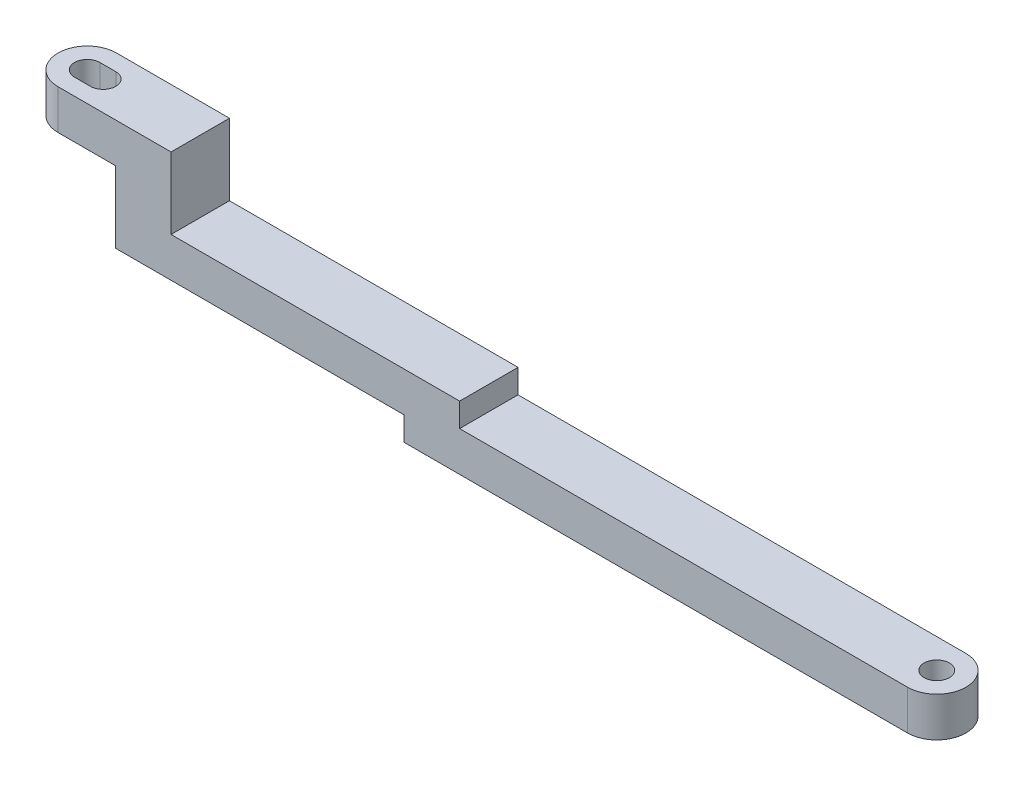
ISO-10303-21;
HEADER;
FILE_DESCRIPTION(('STEP AP214'),'2;1');
FILE_NAME('part.step','',(''),(''),'','','');
FILE_SCHEMA(('AUTOMOTIVE_DESIGN { 1 0 10303 214 1 1 1 1 }'));
ENDSEC;
DATA;
#1=APPLICATION_CONTEXT('core data for automotive mechanical design processes');
#2=APPLICATION_PROTOCOL_DEFINITION('international standard','automotive_design',2000,#1);
#3=PRODUCT_CONTEXT('',#1,'mechanical');
#4=PRODUCT('Part','Part','',(#3));
#5=PRODUCT_RELATED_PRODUCT_CATEGORY('part','',(#4));
#6=PRODUCT_DEFINITION_FORMATION('','',#4);
#7=PRODUCT_DEFINITION_CONTEXT('part definition',#1,'design');
#8=PRODUCT_DEFINITION('design','',#6,#7);
#9=PRODUCT_DEFINITION_SHAPE('','',#8);
#10=(LENGTH_UNIT() NAMED_UNIT(*) SI_UNIT(.MILLI.,.METRE.));
#11=(NAMED_UNIT(*) PLANE_ANGLE_UNIT() SI_UNIT($,.RADIAN.));
#12=(NAMED_UNIT(*) SI_UNIT($,.STERADIAN.) SOLID_ANGLE_UNIT());
#13=UNCERTAINTY_MEASURE_WITH_UNIT(LENGTH_MEASURE(1.E-05),#10,'distance_accuracy_value','');
#14=(GEOMETRIC_REPRESENTATION_CONTEXT(3) GLOBAL_UNCERTAINTY_ASSIGNED_CONTEXT((#13)) GLOBAL_UNIT_ASSIGNED_CONTEXT((#10,
#11,#12)) REPRESENTATION_CONTEXT('',''));
#15=CARTESIAN_POINT('',(0.,0.,0.));
#16=DIRECTION('',(0.,0.,1.));
#17=DIRECTION('',(1.,0.,0.));
#18=AXIS2_PLACEMENT_3D('',#15,#16,#17);
#19=CARTESIAN_POINT('',(107.,-3.00000000000203,0.));
#20=DIRECTION('',(0.,-1.,0.));
#21=DIRECTION('',(1.,0.,0.));
#22=AXIS2_PLACEMENT_3D('',#19,#20,#21);
#23=PLANE('',#22);
#24=DIRECTION('',(-1.,0.,0.));
#25=VECTOR('',#24,1.);
#26=CARTESIAN_POINT('',(136.975883288119,-3.00000000000203,3.68));
#27=LINE('',#26,#25);
#28=CARTESIAN_POINT('',(107.,-3.00000000000203,3.68));
#29=VERTEX_POINT('',#28);
#30=CARTESIAN_POINT('',(43.582681690261,-3.00000000000203,3.68));
#31=VERTEX_POINT('',#30);
#32=EDGE_CURVE('E129',#29,#31,#27,.T.);
#33=ORIENTED_EDGE('',*,*,#32,.T.);
#34=DIRECTION('',(0.,0.,1.));
#35=VECTOR('',#34,1.);
#36=CARTESIAN_POINT('',(43.582681690261,-3.00000000000203,0.));
#37=LINE('',#36,#35);
#38=CARTESIAN_POINT('',(43.582681690261,-3.00000000000203,-3.68));
#39=VERTEX_POINT('',#38);
#40=EDGE_CURVE('E243',#39,#31,#37,.T.);
#41=ORIENTED_EDGE('',*,*,#40,.F.);
#42=DIRECTION('',(1.,0.,0.));
#43=VECTOR('',#42,1.);
#44=CARTESIAN_POINT('',(136.975883288119,-3.00000000000203,-3.68));
#45=LINE('',#44,#43);
#46=CARTESIAN_POINT('',(107.,-3.00000000000203,-3.68));
#47=VERTEX_POINT('',#46);
#48=EDGE_CURVE('E100',#39,#47,#45,.T.);
#49=ORIENTED_EDGE('',*,*,#48,.T.);
#50=CARTESIAN_POINT('',(107.,-3.00000000000203,0.));
#51=DIRECTION('',(0.,-1.,0.));
#52=DIRECTION('',(1.,0.,0.));
#53=AXIS2_PLACEMENT_3D('',#50,#51,#52);
#54=CIRCLE('',#53,3.68);
#55=EDGE_CURVE('E264',#47,#29,#54,.T.);
#56=ORIENTED_EDGE('',*,*,#55,.T.);
#57=EDGE_LOOP('',(#33,#41,#49,#56));
#58=FACE_BOUND('',#57,.T.);
#59=CARTESIAN_POINT('',(107.,-3.00000000000203,0.));
#60=DIRECTION('',(0.,-1.,0.));
#61=DIRECTION('',(1.,0.,0.));
#62=AXIS2_PLACEMENT_3D('',#59,#60,#61);
#63=CIRCLE('',#62,1.60000000000001);
#64=CARTESIAN_POINT('',(108.6,-3.00000000000203,0.));
#65=VERTEX_POINT('',#64);
#66=EDGE_CURVE('E139',#65,#65,#63,.T.);
#67=ORIENTED_EDGE('',*,*,#66,.F.);
#68=EDGE_LOOP('',(#67));
#69=FACE_BOUND('',#68,.T.);
#70=ADVANCED_FACE('F81',(#58,#69),#23,.T.);
#71=CARTESIAN_POINT('',(107.,1.99999999999797,0.));
#72=DIRECTION('',(0.,-1.,0.));
#73=DIRECTION('',(1.,0.,0.));
#74=AXIS2_PLACEMENT_3D('',#71,#72,#73);
#75=PLANE('',#74);
#76=DIRECTION('',(0.,0.,1.));
#77=VECTOR('',#76,1.);
#78=CARTESIAN_POINT('',(50.582681690261,1.99999999999797,1.20267248289405));
#79=LINE('',#78,#77);
#80=CARTESIAN_POINT('',(50.582681690261,1.99999999999797,-3.68));
#81=VERTEX_POINT('',#80);
#82=CARTESIAN_POINT('',(50.582681690261,1.99999999999797,3.68));
#83=VERTEX_POINT('',#82);
#84=EDGE_CURVE('E124',#81,#83,#79,.T.);
#85=ORIENTED_EDGE('',*,*,#84,.T.);
#86=DIRECTION('',(-1.,0.,0.));
#87=VECTOR('',#86,1.);
#88=CARTESIAN_POINT('',(136.975883288119,1.99999999999797,3.68));
#89=LINE('',#88,#87);
#90=CARTESIAN_POINT('',(107.,1.99999999999797,3.68));
#91=VERTEX_POINT('',#90);
#92=EDGE_CURVE('E140',#91,#83,#89,.T.);
#93=ORIENTED_EDGE('',*,*,#92,.F.);
#94=CARTESIAN_POINT('',(107.,1.99999999999797,0.));
#95=DIRECTION('',(0.,-1.,0.));
#96=DIRECTION('',(1.,0.,0.));
#97=AXIS2_PLACEMENT_3D('',#94,#95,#96);
#98=CIRCLE('',#97,3.68);
#99=CARTESIAN_POINT('',(107.,1.99999999999797,-3.68));
#100=VERTEX_POINT('',#99);
#101=EDGE_CURVE('E123',#100,#91,#98,.T.);
#102=ORIENTED_EDGE('',*,*,#101,.F.);
#103=DIRECTION('',(1.,0.,0.));
#104=VECTOR('',#103,1.);
#105=CARTESIAN_POINT('',(136.975883288119,1.99999999999797,-3.68));
#106=LINE('',#105,#104);
#107=EDGE_CURVE('E114',#81,#100,#106,.T.);
#108=ORIENTED_EDGE('',*,*,#107,.F.);
#109=EDGE_LOOP('',(#85,#93,#102,#108));
#110=FACE_BOUND('',#109,.T.);
#111=CARTESIAN_POINT('',(107.,1.99999999999797,0.));
#112=DIRECTION('',(0.,-1.,0.));
#113=DIRECTION('',(1.,0.,0.));
#114=AXIS2_PLACEMENT_3D('',#111,#112,#113);
#115=CIRCLE('',#114,1.60000000000001);
#116=CARTESIAN_POINT('',(108.6,1.99999999999797,0.));
#117=VERTEX_POINT('',#116);
#118=EDGE_CURVE('E250',#117,#117,#115,.T.);
#119=ORIENTED_EDGE('',*,*,#118,.T.);
#120=EDGE_LOOP('',(#119));
#121=FACE_BOUND('',#120,.T.);
#122=ADVANCED_FACE('F119',(#110,#121),#75,.F.);
#123=CARTESIAN_POINT('',(136.975883288119,-3.00000000000203,-3.68));
#124=DIRECTION('',(0.,0.,1.));
#125=DIRECTION('',(1.,0.,0.));
#126=AXIS2_PLACEMENT_3D('',#123,#124,#125);
#127=PLANE('',#126);
#128=DIRECTION('',(0.,-1.,0.));
#129=VECTOR('',#128,1.);
#130=CARTESIAN_POINT('',(50.582681690261,13.9999999999988,-3.68));
#131=LINE('',#130,#129);
#132=CARTESIAN_POINT('',(50.582681690261,5.,-3.68));
#133=VERTEX_POINT('',#132);
#134=EDGE_CURVE('E132',#133,#81,#131,.T.);
#135=ORIENTED_EDGE('',*,*,#134,.T.);
#136=ORIENTED_EDGE('',*,*,#107,.T.);
#137=DIRECTION('',(0.,1.,0.));
#138=VECTOR('',#137,1.);
#139=CARTESIAN_POINT('',(107.,-3.00000000000203,-3.68));
#140=LINE('',#139,#138);
#141=EDGE_CURVE('E12',#47,#100,#140,.T.);
#142=ORIENTED_EDGE('',*,*,#141,.F.);
#143=ORIENTED_EDGE('',*,*,#48,.F.);
#144=DIRECTION('',(0.,1.,0.));
#145=VECTOR('',#144,1.);
#146=CARTESIAN_POINT('',(43.582681690261,-13.1572437206184,-3.68));
#147=LINE('',#146,#145);
#148=CARTESIAN_POINT('',(43.582681690261,0.,-3.68));
#149=VERTEX_POINT('',#148);
#150=EDGE_CURVE('E247',#39,#149,#147,.T.);
#151=ORIENTED_EDGE('',*,*,#150,.T.);
#152=DIRECTION('',(1.,0.,0.));
#153=VECTOR('',#152,1.);
#154=CARTESIAN_POINT('',(0.,0.,-3.68));
#155=LINE('',#154,#153);
#156=CARTESIAN_POINT('',(7.2341425037902,0.,-3.68));
#157=VERTEX_POINT('',#156);
#158=EDGE_CURVE('E152',#157,#149,#155,.T.);
#159=ORIENTED_EDGE('',*,*,#158,.F.);
#160=DIRECTION('',(0.,-1.,0.));
#161=VECTOR('',#160,1.);
#162=CARTESIAN_POINT('',(7.2341425037902,24.1572437206151,-3.68));
#163=LINE('',#162,#161);
#164=CARTESIAN_POINT('',(7.2341425037902,8.99999999999878,-3.68));
#165=VERTEX_POINT('',#164);
#166=EDGE_CURVE('E166',#165,#157,#163,.T.);
#167=ORIENTED_EDGE('',*,*,#166,.F.);
#168=DIRECTION('',(-1.,0.,0.));
#169=VECTOR('',#168,1.);
#170=CARTESIAN_POINT('',(-8.85333473199523E-11,8.99999999999878,-3.68));
#171=LINE('',#170,#169);
#172=CARTESIAN_POINT('',(0.,8.99999999999878,-3.68));
#173=VERTEX_POINT('',#172);
#174=EDGE_CURVE('E225',#165,#173,#171,.T.);
#175=ORIENTED_EDGE('',*,*,#174,.T.);
#176=DIRECTION('',(0.,1.,0.));
#177=VECTOR('',#176,1.);
#178=CARTESIAN_POINT('',(0.,8.99999999999878,-3.68));
#179=LINE('',#178,#177);
#180=CARTESIAN_POINT('',(0.,13.9999999999988,-3.68));
#181=VERTEX_POINT('',#180);
#182=EDGE_CURVE('E223',#173,#181,#179,.T.);
#183=ORIENTED_EDGE('',*,*,#182,.T.);
#184=DIRECTION('',(-1.,0.,0.));
#185=VECTOR('',#184,1.);
#186=CARTESIAN_POINT('',(-8.85333473199523E-11,13.9999999999988,-3.68));
#187=LINE('',#186,#185);
#188=CARTESIAN_POINT('',(14.2341425037902,13.9999999999988,-3.68));
#189=VERTEX_POINT('',#188);
#190=EDGE_CURVE('E218',#189,#181,#187,.T.);
#191=ORIENTED_EDGE('',*,*,#190,.F.);
#192=DIRECTION('',(0.,-1.,0.));
#193=VECTOR('',#192,1.);
#194=CARTESIAN_POINT('',(14.2341425037902,24.1572437206151,-3.68));
#195=LINE('',#194,#193);
#196=CARTESIAN_POINT('',(14.2341425037902,5.,-3.68));
#197=VERTEX_POINT('',#196);
#198=EDGE_CURVE('E164',#189,#197,#195,.T.);
#199=ORIENTED_EDGE('',*,*,#198,.T.);
#200=DIRECTION('',(-1.,0.,0.));
#201=VECTOR('',#200,1.);
#202=CARTESIAN_POINT('',(0.,5.,-3.68));
#203=LINE('',#202,#201);
#204=EDGE_CURVE('E144',#133,#197,#203,.T.);
#205=ORIENTED_EDGE('',*,*,#204,.F.);
#206=EDGE_LOOP('',(#135,#136,#142,#143,#151,#159,#167,#175,#183,#191,#199,#205));
#207=FACE_BOUND('',#206,.T.);
#208=ADVANCED_FACE('F142',(#207),#127,.F.);
#209=CARTESIAN_POINT('',(107.,-3.00000000000203,0.));
#210=DIRECTION('',(0.,1.,0.));
#211=DIRECTION('',(0.,0.,1.));
#212=AXIS2_PLACEMENT_3D('',#209,#210,#211);
#213=CYLINDRICAL_SURFACE('',#212,3.68);
#214=ORIENTED_EDGE('',*,*,#101,.T.);
#215=DIRECTION('',(0.,1.,0.));
#216=VECTOR('',#215,1.);
#217=CARTESIAN_POINT('',(107.,-3.00000000000203,3.68));
#218=LINE('',#217,#216);
#219=EDGE_CURVE('E88',#29,#91,#218,.T.);
#220=ORIENTED_EDGE('',*,*,#219,.F.);
#221=ORIENTED_EDGE('',*,*,#55,.F.);
#222=ORIENTED_EDGE('',*,*,#141,.T.);
#223=EDGE_LOOP('',(#214,#220,#221,#222));
#224=FACE_BOUND('',#223,.T.);
#225=ADVANCED_FACE('F266',(#224),#213,.T.);
#226=CARTESIAN_POINT('',(136.975883288119,-3.00000000000203,3.68));
#227=DIRECTION('',(0.,0.,-1.));
#228=DIRECTION('',(-1.,0.,0.));
#229=AXIS2_PLACEMENT_3D('',#226,#227,#228);
#230=PLANE('',#229);
#231=ORIENTED_EDGE('',*,*,#92,.T.);
#232=DIRECTION('',(0.,-1.,0.));
#233=VECTOR('',#232,1.);
#234=CARTESIAN_POINT('',(50.582681690261,13.9999999999988,3.68));
#235=LINE('',#234,#233);
#236=CARTESIAN_POINT('',(50.582681690261,5.,3.68));
#237=VERTEX_POINT('',#236);
#238=EDGE_CURVE('E137',#237,#83,#235,.T.);
#239=ORIENTED_EDGE('',*,*,#238,.F.);
#240=DIRECTION('',(1.,0.,0.));
#241=VECTOR('',#240,1.);
#242=CARTESIAN_POINT('',(0.,5.,3.68));
#243=LINE('',#242,#241);
#244=CARTESIAN_POINT('',(14.2341425037902,5.,3.68));
#245=VERTEX_POINT('',#244);
#246=EDGE_CURVE('E143',#245,#237,#243,.T.);
#247=ORIENTED_EDGE('',*,*,#246,.F.);
#248=DIRECTION('',(0.,-1.,0.));
#249=VECTOR('',#248,1.);
#250=CARTESIAN_POINT('',(14.2341425037902,24.1572437206151,3.68));
#251=LINE('',#250,#249);
#252=CARTESIAN_POINT('',(14.2341425037902,13.9999999999988,3.68));
#253=VERTEX_POINT('',#252);
#254=EDGE_CURVE('E170',#253,#245,#251,.T.);
#255=ORIENTED_EDGE('',*,*,#254,.F.);
#256=DIRECTION('',(1.,0.,0.));
#257=VECTOR('',#256,1.);
#258=CARTESIAN_POINT('',(-8.85333473199523E-11,13.9999999999988,3.68));
#259=LINE('',#258,#257);
#260=CARTESIAN_POINT('',(0.,13.9999999999988,3.68));
#261=VERTEX_POINT('',#260);
#262=EDGE_CURVE('E214',#261,#253,#259,.T.);
#263=ORIENTED_EDGE('',*,*,#262,.F.);
#264=DIRECTION('',(0.,1.,0.));
#265=VECTOR('',#264,1.);
#266=CARTESIAN_POINT('',(0.,8.99999999999879,3.68));
#267=LINE('',#266,#265);
#268=CARTESIAN_POINT('',(0.,8.99999999999879,3.68));
#269=VERTEX_POINT('',#268);
#270=EDGE_CURVE('E232',#269,#261,#267,.T.);
#271=ORIENTED_EDGE('',*,*,#270,.F.);
#272=DIRECTION('',(1.,0.,0.));
#273=VECTOR('',#272,1.);
#274=CARTESIAN_POINT('',(-8.85333473199523E-11,8.99999999999879,3.68));
#275=LINE('',#274,#273);
#276=CARTESIAN_POINT('',(7.2341425037902,8.99999999999879,3.68));
#277=VERTEX_POINT('',#276);
#278=EDGE_CURVE('E212',#269,#277,#275,.T.);
#279=ORIENTED_EDGE('',*,*,#278,.T.);
#280=DIRECTION('',(0.,-1.,0.));
#281=VECTOR('',#280,1.);
#282=CARTESIAN_POINT('',(7.2341425037902,24.1572437206151,3.68));
#283=LINE('',#282,#281);
#284=CARTESIAN_POINT('',(7.2341425037902,0.,3.68));
#285=VERTEX_POINT('',#284);
#286=EDGE_CURVE('E157',#277,#285,#283,.T.);
#287=ORIENTED_EDGE('',*,*,#286,.T.);
#288=DIRECTION('',(-1.,0.,0.));
#289=VECTOR('',#288,1.);
#290=CARTESIAN_POINT('',(0.,0.,3.68));
#291=LINE('',#290,#289);
#292=CARTESIAN_POINT('',(43.582681690261,0.,3.68));
#293=VERTEX_POINT('',#292);
#294=EDGE_CURVE('E158',#293,#285,#291,.T.);
#295=ORIENTED_EDGE('',*,*,#294,.F.);
#296=DIRECTION('',(0.,1.,0.));
#297=VECTOR('',#296,1.);
#298=CARTESIAN_POINT('',(43.582681690261,-13.1572437206184,3.68));
#299=LINE('',#298,#297);
#300=EDGE_CURVE('E252',#31,#293,#299,.T.);
#301=ORIENTED_EDGE('',*,*,#300,.F.);
#302=ORIENTED_EDGE('',*,*,#32,.F.);
#303=ORIENTED_EDGE('',*,*,#219,.T.);
#304=EDGE_LOOP('',(#231,#239,#247,#255,#263,#271,#279,#287,#295,#301,#302,#303));
#305=FACE_BOUND('',#304,.T.);
#306=ADVANCED_FACE('F83',(#305),#230,.F.);
#307=CARTESIAN_POINT('',(107.,-3.00000000000203,0.));
#308=DIRECTION('',(0.,1.,0.));
#309=DIRECTION('',(0.,0.,1.));
#310=AXIS2_PLACEMENT_3D('',#307,#308,#309);
#311=CYLINDRICAL_SURFACE('',#310,1.60000000000001);
#312=ORIENTED_EDGE('',*,*,#66,.T.);
#313=EDGE_LOOP('',(#312));
#314=FACE_BOUND('',#313,.T.);
#315=ORIENTED_EDGE('',*,*,#118,.F.);
#316=EDGE_LOOP('',(#315));
#317=FACE_BOUND('',#316,.T.);
#318=ADVANCED_FACE('F368',(#314,#317),#311,.F.);
#319=CARTESIAN_POINT('',(43.582681690261,-13.1572437206184,0.));
#320=DIRECTION('',(-1.,0.,0.));
#321=DIRECTION('',(0.,0.,1.));
#322=AXIS2_PLACEMENT_3D('',#319,#320,#321);
#323=PLANE('',#322);
#324=ORIENTED_EDGE('',*,*,#150,.F.);
#325=ORIENTED_EDGE('',*,*,#40,.T.);
#326=ORIENTED_EDGE('',*,*,#300,.T.);
#327=DIRECTION('',(0.,0.,1.));
#328=VECTOR('',#327,1.);
#329=CARTESIAN_POINT('',(43.582681690261,0.,0.));
#330=LINE('',#329,#328);
#331=EDGE_CURVE('E242',#149,#293,#330,.T.);
#332=ORIENTED_EDGE('',*,*,#331,.F.);
#333=EDGE_LOOP('',(#324,#325,#326,#332));
#334=FACE_BOUND('',#333,.T.);
#335=ADVANCED_FACE('F366',(#334),#323,.T.);
#336=CARTESIAN_POINT('',(50.582681690261,13.9999999999988,0.));
#337=DIRECTION('',(1.,0.,0.));
#338=DIRECTION('',(0.,0.,-1.));
#339=AXIS2_PLACEMENT_3D('',#336,#337,#338);
#340=PLANE('',#339);
#341=ORIENTED_EDGE('',*,*,#84,.F.);
#342=ORIENTED_EDGE('',*,*,#134,.F.);
#343=DIRECTION('',(0.,0.,-1.));
#344=VECTOR('',#343,1.);
#345=CARTESIAN_POINT('',(50.582681690261,5.,0.));
#346=LINE('',#345,#344);
#347=EDGE_CURVE('E241',#237,#133,#346,.T.);
#348=ORIENTED_EDGE('',*,*,#347,.F.);
#349=ORIENTED_EDGE('',*,*,#238,.T.);
#350=EDGE_LOOP('',(#341,#342,#348,#349));
#351=FACE_BOUND('',#350,.T.);
#352=ADVANCED_FACE('F127',(#351),#340,.T.);
#353=CARTESIAN_POINT('',(0.,0.,0.));
#354=DIRECTION('',(0.,-1.,0.));
#355=DIRECTION('',(0.,0.,-1.));
#356=AXIS2_PLACEMENT_3D('',#353,#354,#355);
#357=PLANE('',#356);
#358=ORIENTED_EDGE('',*,*,#158,.T.);
#359=ORIENTED_EDGE('',*,*,#331,.T.);
#360=ORIENTED_EDGE('',*,*,#294,.T.);
#361=DIRECTION('',(0.,0.,-1.));
#362=VECTOR('',#361,1.);
#363=CARTESIAN_POINT('',(7.2341425037902,0.,0.));
#364=LINE('',#363,#362);
#365=EDGE_CURVE('E160',#285,#157,#364,.T.);
#366=ORIENTED_EDGE('',*,*,#365,.T.);
#367=EDGE_LOOP('',(#358,#359,#360,#366));
#368=FACE_BOUND('',#367,.T.);
#369=ADVANCED_FACE('F365',(#368),#357,.T.);
#370=CARTESIAN_POINT('',(0.,5.,0.));
#371=DIRECTION('',(0.,1.,0.));
#372=DIRECTION('',(0.,0.,1.));
#373=AXIS2_PLACEMENT_3D('',#370,#371,#372);
#374=PLANE('',#373);
#375=ORIENTED_EDGE('',*,*,#246,.T.);
#376=ORIENTED_EDGE('',*,*,#347,.T.);
#377=ORIENTED_EDGE('',*,*,#204,.T.);
#378=DIRECTION('',(0.,0.,-1.));
#379=VECTOR('',#378,1.);
#380=CARTESIAN_POINT('',(14.2341425037902,5.,0.));
#381=LINE('',#380,#379);
#382=EDGE_CURVE('E238',#245,#197,#381,.T.);
#383=ORIENTED_EDGE('',*,*,#382,.F.);
#384=EDGE_LOOP('',(#375,#376,#377,#383));
#385=FACE_BOUND('',#384,.T.);
#386=ADVANCED_FACE('F336',(#385),#374,.T.);
#387=CARTESIAN_POINT('',(0.,8.99999999999878,0.));
#388=DIRECTION('',(0.,1.,0.));
#389=DIRECTION('',(0.,0.,1.));
#390=AXIS2_PLACEMENT_3D('',#387,#388,#389);
#391=PLANE('',#390);
#392=DIRECTION('',(0.,0.,1.));
#393=VECTOR('',#392,1.);
#394=CARTESIAN_POINT('',(7.2341425037902,8.99999999999879,-1.96917283696128E-11));
#395=LINE('',#394,#393);
#396=EDGE_CURVE('E211',#165,#277,#395,.T.);
#397=ORIENTED_EDGE('',*,*,#396,.T.);
#398=ORIENTED_EDGE('',*,*,#278,.F.);
#399=CARTESIAN_POINT('',(0.,8.99999999999878,0.));
#400=DIRECTION('',(0.,1.,0.));
#401=DIRECTION('',(0.,0.,1.));
#402=AXIS2_PLACEMENT_3D('',#399,#400,#401);
#403=CIRCLE('',#402,3.68);
#404=EDGE_CURVE('E220',#173,#269,#403,.T.);
#405=ORIENTED_EDGE('',*,*,#404,.F.);
#406=ORIENTED_EDGE('',*,*,#174,.F.);
#407=EDGE_LOOP('',(#397,#398,#405,#406));
#408=FACE_BOUND('',#407,.T.);
#409=DIRECTION('',(-1.,0.,0.));
#410=VECTOR('',#409,1.);
#411=CARTESIAN_POINT('',(-8.85333473199523E-11,8.99999999999879,1.6));
#412=LINE('',#411,#410);
#413=CARTESIAN_POINT('',(2.,8.99999999999879,1.6));
#414=VERTEX_POINT('',#413);
#415=CARTESIAN_POINT('',(0.,8.99999999999879,1.6));
#416=VERTEX_POINT('',#415);
#417=EDGE_CURVE('E176',#414,#416,#412,.T.);
#418=ORIENTED_EDGE('',*,*,#417,.F.);
#419=CARTESIAN_POINT('',(2.,8.99999999999878,0.));
#420=DIRECTION('',(0.,1.,0.));
#421=DIRECTION('',(0.,0.,1.));
#422=AXIS2_PLACEMENT_3D('',#419,#420,#421);
#423=CIRCLE('',#422,1.6);
#424=CARTESIAN_POINT('',(2.,8.99999999999878,-1.6));
#425=VERTEX_POINT('',#424);
#426=EDGE_CURVE('E187',#414,#425,#423,.T.);
#427=ORIENTED_EDGE('',*,*,#426,.T.);
#428=DIRECTION('',(1.,0.,0.));
#429=VECTOR('',#428,1.);
#430=CARTESIAN_POINT('',(-8.85333473199523E-11,8.99999999999878,-1.6));
#431=LINE('',#430,#429);
#432=CARTESIAN_POINT('',(0.,8.99999999999878,-1.6));
#433=VERTEX_POINT('',#432);
#434=EDGE_CURVE('E182',#433,#425,#431,.T.);
#435=ORIENTED_EDGE('',*,*,#434,.F.);
#436=CARTESIAN_POINT('',(0.,8.99999999999878,0.));
#437=DIRECTION('',(0.,1.,0.));
#438=DIRECTION('',(0.,0.,1.));
#439=AXIS2_PLACEMENT_3D('',#436,#437,#438);
#440=CIRCLE('',#439,1.6);
#441=EDGE_CURVE('E177',#433,#416,#440,.T.);
#442=ORIENTED_EDGE('',*,*,#441,.T.);
#443=EDGE_LOOP('',(#418,#427,#435,#442));
#444=FACE_BOUND('',#443,.T.);
#445=ADVANCED_FACE('F351',(#408,#444),#391,.F.);
#446=CARTESIAN_POINT('',(0.,13.9999999999988,0.));
#447=DIRECTION('',(0.,1.,0.));
#448=DIRECTION('',(0.,0.,1.));
#449=AXIS2_PLACEMENT_3D('',#446,#447,#448);
#450=PLANE('',#449);
#451=ORIENTED_EDGE('',*,*,#262,.T.);
#452=DIRECTION('',(0.,0.,-1.));
#453=VECTOR('',#452,1.);
#454=CARTESIAN_POINT('',(14.2341425037902,13.9999999999988,0.));
#455=LINE('',#454,#453);
#456=EDGE_CURVE('E154',#253,#189,#455,.T.);
#457=ORIENTED_EDGE('',*,*,#456,.T.);
#458=ORIENTED_EDGE('',*,*,#190,.T.);
#459=CARTESIAN_POINT('',(0.,13.9999999999988,0.));
#460=DIRECTION('',(0.,1.,0.));
#461=DIRECTION('',(0.,0.,1.));
#462=AXIS2_PLACEMENT_3D('',#459,#460,#461);
#463=CIRCLE('',#462,3.68);
#464=EDGE_CURVE('E226',#181,#261,#463,.T.);
#465=ORIENTED_EDGE('',*,*,#464,.T.);
#466=EDGE_LOOP('',(#451,#457,#458,#465));
#467=FACE_BOUND('',#466,.T.);
#468=CARTESIAN_POINT('',(2.,13.9999999999988,0.));
#469=DIRECTION('',(0.,1.,0.));
#470=DIRECTION('',(0.,0.,1.));
#471=AXIS2_PLACEMENT_3D('',#468,#469,#470);
#472=CIRCLE('',#471,1.6);
#473=CARTESIAN_POINT('',(2.,13.9999999999988,1.6));
#474=VERTEX_POINT('',#473);
#475=CARTESIAN_POINT('',(2.,13.9999999999988,-1.6));
#476=VERTEX_POINT('',#475);
#477=EDGE_CURVE('E179',#474,#476,#472,.T.);
#478=ORIENTED_EDGE('',*,*,#477,.F.);
#479=DIRECTION('',(-1.,0.,0.));
#480=VECTOR('',#479,1.);
#481=CARTESIAN_POINT('',(-8.85333473199523E-11,13.9999999999988,1.6));
#482=LINE('',#481,#480);
#483=CARTESIAN_POINT('',(0.,13.9999999999988,1.6));
#484=VERTEX_POINT('',#483);
#485=EDGE_CURVE('E174',#474,#484,#482,.T.);
#486=ORIENTED_EDGE('',*,*,#485,.T.);
#487=CARTESIAN_POINT('',(0.,13.9999999999988,0.));
#488=DIRECTION('',(0.,1.,0.));
#489=DIRECTION('',(0.,0.,1.));
#490=AXIS2_PLACEMENT_3D('',#487,#488,#489);
#491=CIRCLE('',#490,1.6);
#492=CARTESIAN_POINT('',(0.,13.9999999999988,-1.6));
#493=VERTEX_POINT('',#492);
#494=EDGE_CURVE('E191',#493,#484,#491,.T.);
#495=ORIENTED_EDGE('',*,*,#494,.F.);
#496=DIRECTION('',(1.,0.,0.));
#497=VECTOR('',#496,1.);
#498=CARTESIAN_POINT('',(-8.85333473199523E-11,13.9999999999988,-1.6));
#499=LINE('',#498,#497);
#500=EDGE_CURVE('E192',#493,#476,#499,.T.);
#501=ORIENTED_EDGE('',*,*,#500,.T.);
#502=EDGE_LOOP('',(#478,#486,#495,#501));
#503=FACE_BOUND('',#502,.T.);
#504=ADVANCED_FACE('F342',(#467,#503),#450,.T.);
#505=CARTESIAN_POINT('',(0.,8.99999999999878,0.));
#506=DIRECTION('',(0.,1.,0.));
#507=DIRECTION('',(0.,0.,1.));
#508=AXIS2_PLACEMENT_3D('',#505,#506,#507);
#509=CYLINDRICAL_SURFACE('',#508,3.68);
#510=ORIENTED_EDGE('',*,*,#464,.F.);
#511=ORIENTED_EDGE('',*,*,#182,.F.);
#512=ORIENTED_EDGE('',*,*,#404,.T.);
#513=ORIENTED_EDGE('',*,*,#270,.T.);
#514=EDGE_LOOP('',(#510,#511,#512,#513));
#515=FACE_BOUND('',#514,.T.);
#516=ADVANCED_FACE('F346',(#515),#509,.T.);
#517=CARTESIAN_POINT('',(-8.85333473199523E-11,8.99999999999879,1.6));
#518=DIRECTION('',(0.,0.,-1.));
#519=DIRECTION('',(-1.,0.,0.));
#520=AXIS2_PLACEMENT_3D('',#517,#518,#519);
#521=PLANE('',#520);
#522=ORIENTED_EDGE('',*,*,#485,.F.);
#523=DIRECTION('',(0.,1.,0.));
#524=VECTOR('',#523,1.);
#525=CARTESIAN_POINT('',(2.,8.99999999999879,1.6));
#526=LINE('',#525,#524);
#527=EDGE_CURVE('E186',#414,#474,#526,.T.);
#528=ORIENTED_EDGE('',*,*,#527,.F.);
#529=ORIENTED_EDGE('',*,*,#417,.T.);
#530=DIRECTION('',(0.,1.,0.));
#531=VECTOR('',#530,1.);
#532=CARTESIAN_POINT('',(0.,8.99999999999879,1.6));
#533=LINE('',#532,#531);
#534=EDGE_CURVE('E206',#416,#484,#533,.T.);
#535=ORIENTED_EDGE('',*,*,#534,.T.);
#536=EDGE_LOOP('',(#522,#528,#529,#535));
#537=FACE_BOUND('',#536,.T.);
#538=ADVANCED_FACE('F477',(#537),#521,.T.);
#539=CARTESIAN_POINT('',(0.,8.99999999999878,0.));
#540=DIRECTION('',(0.,1.,0.));
#541=DIRECTION('',(0.,0.,1.));
#542=AXIS2_PLACEMENT_3D('',#539,#540,#541);
#543=CYLINDRICAL_SURFACE('',#542,1.6);
#544=ORIENTED_EDGE('',*,*,#494,.T.);
#545=ORIENTED_EDGE('',*,*,#534,.F.);
#546=ORIENTED_EDGE('',*,*,#441,.F.);
#547=DIRECTION('',(0.,1.,0.));
#548=VECTOR('',#547,1.);
#549=CARTESIAN_POINT('',(0.,8.99999999999878,-1.6));
#550=LINE('',#549,#548);
#551=EDGE_CURVE('E203',#433,#493,#550,.T.);
#552=ORIENTED_EDGE('',*,*,#551,.T.);
#553=EDGE_LOOP('',(#544,#545,#546,#552));
#554=FACE_BOUND('',#553,.T.);
#555=ADVANCED_FACE('F481',(#554),#543,.F.);
#556=CARTESIAN_POINT('',(-8.85333473199523E-11,8.99999999999878,-1.6));
#557=DIRECTION('',(0.,0.,1.));
#558=DIRECTION('',(1.,0.,0.));
#559=AXIS2_PLACEMENT_3D('',#556,#557,#558);
#560=PLANE('',#559);
#561=ORIENTED_EDGE('',*,*,#500,.F.);
#562=ORIENTED_EDGE('',*,*,#551,.F.);
#563=ORIENTED_EDGE('',*,*,#434,.T.);
#564=DIRECTION('',(0.,1.,0.));
#565=VECTOR('',#564,1.);
#566=CARTESIAN_POINT('',(2.,8.99999999999878,-1.6));
#567=LINE('',#566,#565);
#568=EDGE_CURVE('E205',#425,#476,#567,.T.);
#569=ORIENTED_EDGE('',*,*,#568,.T.);
#570=EDGE_LOOP('',(#561,#562,#563,#569));
#571=FACE_BOUND('',#570,.T.);
#572=ADVANCED_FACE('F495',(#571),#560,.T.);
#573=CARTESIAN_POINT('',(2.,8.99999999999878,0.));
#574=DIRECTION('',(0.,1.,0.));
#575=DIRECTION('',(0.,0.,1.));
#576=AXIS2_PLACEMENT_3D('',#573,#574,#575);
#577=CYLINDRICAL_SURFACE('',#576,1.6);
#578=ORIENTED_EDGE('',*,*,#477,.T.);
#579=ORIENTED_EDGE('',*,*,#568,.F.);
#580=ORIENTED_EDGE('',*,*,#426,.F.);
#581=ORIENTED_EDGE('',*,*,#527,.T.);
#582=EDGE_LOOP('',(#578,#579,#580,#581));
#583=FACE_BOUND('',#582,.T.);
#584=ADVANCED_FACE('F499',(#583),#577,.F.);
#585=CARTESIAN_POINT('',(7.2341425037902,24.1572437206151,0.));
#586=DIRECTION('',(-1.,0.,0.));
#587=DIRECTION('',(0.,0.,1.));
#588=AXIS2_PLACEMENT_3D('',#585,#586,#587);
#589=PLANE('',#588);
#590=ORIENTED_EDGE('',*,*,#166,.T.);
#591=ORIENTED_EDGE('',*,*,#365,.F.);
#592=ORIENTED_EDGE('',*,*,#286,.F.);
#593=ORIENTED_EDGE('',*,*,#396,.F.);
#594=EDGE_LOOP('',(#590,#591,#592,#593));
#595=FACE_BOUND('',#594,.T.);
#596=ADVANCED_FACE('F359',(#595),#589,.T.);
#597=CARTESIAN_POINT('',(14.2341425037902,24.1572437206151,0.));
#598=DIRECTION('',(-1.,0.,0.));
#599=DIRECTION('',(0.,0.,1.));
#600=AXIS2_PLACEMENT_3D('',#597,#598,#599);
#601=PLANE('',#600);
#602=ORIENTED_EDGE('',*,*,#254,.T.);
#603=ORIENTED_EDGE('',*,*,#382,.T.);
#604=ORIENTED_EDGE('',*,*,#198,.F.);
#605=ORIENTED_EDGE('',*,*,#456,.F.);
#606=EDGE_LOOP('',(#602,#603,#604,#605));
#607=FACE_BOUND('',#606,.T.);
#608=ADVANCED_FACE('F344',(#607),#601,.F.);
#609=CLOSED_SHELL('',(#70,#122,#208,#225,#306,#318,#335,#352,#369,#386,#445,#504,#516,#538,#555,
#572,#584,#596,#608));
#610=MANIFOLD_SOLID_BREP('B2',#609);
#611=ADVANCED_BREP_SHAPE_REPRESENTATION('',(#18,#610),#14);
#612=SHAPE_DEFINITION_REPRESENTATION(#9,#611);
ENDSEC;
END-ISO-10303-21;
